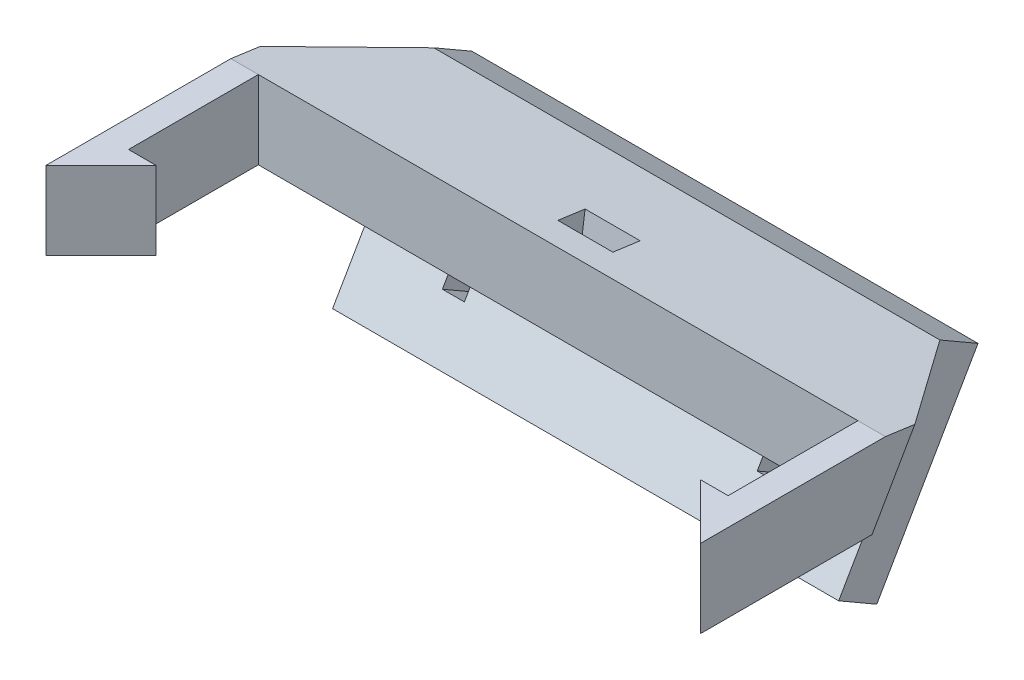
ISO-10303-21;
HEADER;
FILE_DESCRIPTION(('STEP AP214'),'2;1');
FILE_NAME('part.step','',(''),(''),'','','');
FILE_SCHEMA(('AUTOMOTIVE_DESIGN { 1 0 10303 214 1 1 1 1 }'));
ENDSEC;
DATA;
#1=APPLICATION_CONTEXT('core data for automotive mechanical design processes');
#2=APPLICATION_PROTOCOL_DEFINITION('international standard','automotive_design',2000,#1);
#3=PRODUCT_CONTEXT('',#1,'mechanical');
#4=PRODUCT('Part','Part','',(#3));
#5=PRODUCT_RELATED_PRODUCT_CATEGORY('part','',(#4));
#6=PRODUCT_DEFINITION_FORMATION('','',#4);
#7=PRODUCT_DEFINITION_CONTEXT('part definition',#1,'design');
#8=PRODUCT_DEFINITION('design','',#6,#7);
#9=PRODUCT_DEFINITION_SHAPE('','',#8);
#10=(LENGTH_UNIT() NAMED_UNIT(*) SI_UNIT(.MILLI.,.METRE.));
#11=(NAMED_UNIT(*) PLANE_ANGLE_UNIT() SI_UNIT($,.RADIAN.));
#12=(NAMED_UNIT(*) SI_UNIT($,.STERADIAN.) SOLID_ANGLE_UNIT());
#13=UNCERTAINTY_MEASURE_WITH_UNIT(LENGTH_MEASURE(1.E-05),#10,'distance_accuracy_value','');
#14=(GEOMETRIC_REPRESENTATION_CONTEXT(3) GLOBAL_UNCERTAINTY_ASSIGNED_CONTEXT((#13)) GLOBAL_UNIT_ASSIGNED_CONTEXT((#10,
#11,#12)) REPRESENTATION_CONTEXT('',''));
#15=CARTESIAN_POINT('',(0.,0.,0.));
#16=DIRECTION('',(0.,0.,1.));
#17=DIRECTION('',(1.,0.,0.));
#18=AXIS2_PLACEMENT_3D('',#15,#16,#17);
#19=CARTESIAN_POINT('',(37.7825,2.45728163563475,-14.859));
#20=DIRECTION('',(0.,-0.990554370221696,0.137120529588754));
#21=DIRECTION('',(0.,-0.137120529588754,-0.990554370221696));
#22=AXIS2_PLACEMENT_3D('',#19,#20,#21);
#23=PLANE('',#22);
#24=DIRECTION('',(0.,0.137120529588754,0.990554370221695));
#25=VECTOR('',#24,1.);
#26=CARTESIAN_POINT('',(37.7825,2.45728163563475,-14.859));
#27=LINE('',#26,#25);
#28=CARTESIAN_POINT('',(37.7825,4.04424143907504,-3.39485255702757));
#29=VERTEX_POINT('',#28);
#30=CARTESIAN_POINT('',(37.7825,4.51418432609816,0.));
#31=VERTEX_POINT('',#30);
#32=EDGE_CURVE('E369',#29,#31,#27,.T.);
#33=ORIENTED_EDGE('',*,*,#32,.F.);
#34=DIRECTION('',(-0.595207919734796,-0.110186181779928,-0.795981493270879));
#35=VECTOR('',#34,1.);
#36=CARTESIAN_POINT('',(32.247000729487,3.01949780136409,-10.7975681951293));
#37=LINE('',#36,#35);
#38=CARTESIAN_POINT('',(29.21,2.45728163563475,-14.859));
#39=VERTEX_POINT('',#38);
#40=EDGE_CURVE('E309',#29,#39,#37,.T.);
#41=ORIENTED_EDGE('',*,*,#40,.T.);
#42=DIRECTION('',(1.,0.,0.));
#43=VECTOR('',#42,1.);
#44=CARTESIAN_POINT('',(37.7825,2.45728163563475,-14.859));
#45=LINE('',#44,#43);
#46=CARTESIAN_POINT('',(-29.21,2.45728163563475,-14.859));
#47=VERTEX_POINT('',#46);
#48=EDGE_CURVE('E375',#47,#39,#45,.T.);
#49=ORIENTED_EDGE('',*,*,#48,.F.);
#50=DIRECTION('',(-0.595207919734796,0.110186181779928,0.795981493270879));
#51=VECTOR('',#50,1.);
#52=CARTESIAN_POINT('',(-5.47640170660133,-1.93633358543527,-46.5983374380638));
#53=LINE('',#52,#51);
#54=CARTESIAN_POINT('',(-37.7825,4.04424143907504,-3.39485255702757));
#55=VERTEX_POINT('',#54);
#56=EDGE_CURVE('E328',#47,#55,#53,.T.);
#57=ORIENTED_EDGE('',*,*,#56,.T.);
#58=DIRECTION('',(0.,0.137120529588754,0.990554370221695));
#59=VECTOR('',#58,1.);
#60=CARTESIAN_POINT('',(-37.7825,2.45728163563475,-14.859));
#61=LINE('',#60,#59);
#62=CARTESIAN_POINT('',(-37.7825,4.51418432609816,0.));
#63=VERTEX_POINT('',#62);
#64=EDGE_CURVE('E366',#55,#63,#61,.T.);
#65=ORIENTED_EDGE('',*,*,#64,.T.);
#66=DIRECTION('',(-1.,0.,0.));
#67=VECTOR('',#66,1.);
#68=CARTESIAN_POINT('',(-37.7825,4.51418432609816,0.));
#69=LINE('',#68,#67);
#70=CARTESIAN_POINT('',(-34.6075,4.51418432609816,0.));
#71=VERTEX_POINT('',#70);
#72=EDGE_CURVE('E444',#71,#63,#69,.T.);
#73=ORIENTED_EDGE('',*,*,#72,.F.);
#74=DIRECTION('',(-1.,0.,0.));
#75=VECTOR('',#74,1.);
#76=CARTESIAN_POINT('',(37.7825,4.51418432609816,0.));
#77=LINE('',#76,#75);
#78=CARTESIAN_POINT('',(34.6075,4.51418432609816,0.));
#79=VERTEX_POINT('',#78);
#80=EDGE_CURVE('E371',#79,#71,#77,.T.);
#81=ORIENTED_EDGE('',*,*,#80,.F.);
#82=DIRECTION('',(-1.,0.,0.));
#83=VECTOR('',#82,1.);
#84=CARTESIAN_POINT('',(37.7825,4.51418432609816,0.));
#85=LINE('',#84,#83);
#86=EDGE_CURVE('E415',#31,#79,#85,.T.);
#87=ORIENTED_EDGE('',*,*,#86,.F.);
#88=EDGE_LOOP('',(#33,#41,#49,#57,#65,#73,#81,#87));
#89=FACE_BOUND('',#88,.T.);
#90=DIRECTION('',(0.,0.137120529588754,0.990554370221696));
#91=VECTOR('',#90,1.);
#92=CARTESIAN_POINT('',(-3.175,2.45728163563475,-14.859));
#93=LINE('',#92,#91);
#94=CARTESIAN_POINT('',(-3.175,3.64346896320957,-6.29002025090777));
#95=VERTEX_POINT('',#94);
#96=CARTESIAN_POINT('',(-3.175,4.07882664465387,-3.14501012545389));
#97=VERTEX_POINT('',#96);
#98=EDGE_CURVE('E361',#95,#97,#93,.T.);
#99=ORIENTED_EDGE('',*,*,#98,.F.);
#100=DIRECTION('',(-1.,0.,0.));
#101=VECTOR('',#100,1.);
#102=CARTESIAN_POINT('',(37.7825,3.64346896320957,-6.29002025090777));
#103=LINE('',#102,#101);
#104=CARTESIAN_POINT('',(3.175,3.64346896320957,-6.29002025090777));
#105=VERTEX_POINT('',#104);
#106=EDGE_CURVE('E354',#105,#95,#103,.T.);
#107=ORIENTED_EDGE('',*,*,#106,.F.);
#108=DIRECTION('',(0.,-0.137120529588754,-0.990554370221696));
#109=VECTOR('',#108,1.);
#110=CARTESIAN_POINT('',(3.175,2.45728163563475,-14.859));
#111=LINE('',#110,#109);
#112=CARTESIAN_POINT('',(3.175,4.07882664465387,-3.14501012545389));
#113=VERTEX_POINT('',#112);
#114=EDGE_CURVE('E356',#113,#105,#111,.T.);
#115=ORIENTED_EDGE('',*,*,#114,.F.);
#116=DIRECTION('',(1.,0.,0.));
#117=VECTOR('',#116,1.);
#118=CARTESIAN_POINT('',(37.7825,4.07882664465387,-3.14501012545389));
#119=LINE('',#118,#117);
#120=EDGE_CURVE('E359',#97,#113,#119,.T.);
#121=ORIENTED_EDGE('',*,*,#120,.F.);
#122=EDGE_LOOP('',(#99,#107,#115,#121));
#123=FACE_BOUND('',#122,.T.);
#124=ADVANCED_FACE('F32',(#89,#123),#23,.F.);
#125=CARTESIAN_POINT('',(37.7825,-9.20545357308142,-8.12551668776039));
#126=DIRECTION('',(0.,0.866025403784439,-0.5));
#127=DIRECTION('',(0.,0.5,0.866025403784439));
#128=AXIS2_PLACEMENT_3D('',#125,#126,#127);
#129=PLANE('',#128);
#130=DIRECTION('',(-1.,0.,0.));
#131=VECTOR('',#130,1.);
#132=CARTESIAN_POINT('',(37.7825,-9.20545357308142,-8.12551668776039));
#133=LINE('',#132,#131);
#134=CARTESIAN_POINT('',(29.21,-9.20545357308142,-8.12551668776039));
#135=VERTEX_POINT('',#134);
#136=CARTESIAN_POINT('',(-29.21,-9.20545357308143,-8.1255166877604));
#137=VERTEX_POINT('',#136);
#138=EDGE_CURVE('E364',#135,#137,#133,.T.);
#139=ORIENTED_EDGE('',*,*,#138,.F.);
#140=DIRECTION('',(0.62447833761495,0.39052106404446,0.676402324350864));
#141=VECTOR('',#140,1.);
#142=CARTESIAN_POINT('',(32.5530452068537,-7.11486132561386,-4.50450469723697));
#143=LINE('',#142,#141);
#144=CARTESIAN_POINT('',(36.7117618520232,-4.51418432609816,0.));
#145=VERTEX_POINT('',#144);
#146=EDGE_CURVE('E306',#135,#145,#143,.T.);
#147=ORIENTED_EDGE('',*,*,#146,.T.);
#148=DIRECTION('',(1.,0.,0.));
#149=VECTOR('',#148,1.);
#150=CARTESIAN_POINT('',(37.7825,-4.51418432609816,0.));
#151=LINE('',#150,#149);
#152=CARTESIAN_POINT('',(34.6075,-4.51418432609816,0.));
#153=VERTEX_POINT('',#152);
#154=EDGE_CURVE('E420',#153,#145,#151,.T.);
#155=ORIENTED_EDGE('',*,*,#154,.F.);
#156=DIRECTION('',(-1.,0.,0.));
#157=VECTOR('',#156,1.);
#158=CARTESIAN_POINT('',(37.7825,-4.51418432609816,0.));
#159=LINE('',#158,#157);
#160=CARTESIAN_POINT('',(-34.6075,-4.51418432609816,0.));
#161=VERTEX_POINT('',#160);
#162=EDGE_CURVE('E363',#153,#161,#159,.T.);
#163=ORIENTED_EDGE('',*,*,#162,.T.);
#164=DIRECTION('',(1.,0.,0.));
#165=VECTOR('',#164,1.);
#166=CARTESIAN_POINT('',(-37.7825,-4.51418432609816,0.));
#167=LINE('',#166,#165);
#168=CARTESIAN_POINT('',(-36.7117618520232,-4.51418432609816,0.));
#169=VERTEX_POINT('',#168);
#170=EDGE_CURVE('E439',#169,#161,#167,.T.);
#171=ORIENTED_EDGE('',*,*,#170,.F.);
#172=DIRECTION('',(0.62447833761495,-0.39052106404446,-0.676402324350864));
#173=VECTOR('',#172,1.);
#174=CARTESIAN_POINT('',(-3.08472079088397,-25.5430448403279,-36.4230548359249));
#175=LINE('',#174,#173);
#176=EDGE_CURVE('E325',#169,#137,#175,.T.);
#177=ORIENTED_EDGE('',*,*,#176,.T.);
#178=EDGE_LOOP('',(#139,#147,#155,#163,#171,#177));
#179=FACE_BOUND('',#178,.T.);
#180=DIRECTION('',(0.,-0.5,-0.866025403784439));
#181=VECTOR('',#180,1.);
#182=CARTESIAN_POINT('',(-3.175,-10.3806394339781,-10.1609983071701));
#183=LINE('',#182,#181);
#184=CARTESIAN_POINT('',(-3.175,-5.55963649656401,-1.81077627613001));
#185=VERTEX_POINT('',#184);
#186=CARTESIAN_POINT('',(-3.175,-7.27324892364753,-4.77884006432008));
#187=VERTEX_POINT('',#186);
#188=EDGE_CURVE('E340',#185,#187,#183,.T.);
#189=ORIENTED_EDGE('',*,*,#188,.F.);
#190=DIRECTION('',(-1.,0.,0.));
#191=VECTOR('',#190,1.);
#192=CARTESIAN_POINT('',(-3.175,-5.55963649656401,-1.81077627613001));
#193=LINE('',#192,#191);
#194=CARTESIAN_POINT('',(3.175,-5.55963649656401,-1.81077627613001));
#195=VERTEX_POINT('',#194);
#196=EDGE_CURVE('E342',#195,#185,#193,.T.);
#197=ORIENTED_EDGE('',*,*,#196,.F.);
#198=DIRECTION('',(0.,0.5,0.866025403784439));
#199=VECTOR('',#198,1.);
#200=CARTESIAN_POINT('',(3.175,-10.3806394339781,-10.1609983071701));
#201=LINE('',#200,#199);
#202=CARTESIAN_POINT('',(3.175,-7.27324892364753,-4.77884006432008));
#203=VERTEX_POINT('',#202);
#204=EDGE_CURVE('E334',#203,#195,#201,.T.);
#205=ORIENTED_EDGE('',*,*,#204,.F.);
#206=DIRECTION('',(1.,0.,0.));
#207=VECTOR('',#206,1.);
#208=CARTESIAN_POINT('',(-3.175,-7.27324892364753,-4.77884006432008));
#209=LINE('',#208,#207);
#210=EDGE_CURVE('E337',#187,#203,#209,.T.);
#211=ORIENTED_EDGE('',*,*,#210,.F.);
#212=EDGE_LOOP('',(#189,#197,#205,#211));
#213=FACE_BOUND('',#212,.T.);
#214=ADVANCED_FACE('F501',(#179,#213),#129,.F.);
#215=CARTESIAN_POINT('',(0.,0.,0.));
#216=DIRECTION('',(0.,0.,1.));
#217=DIRECTION('',(1.,0.,0.));
#218=AXIS2_PLACEMENT_3D('',#215,#216,#217);
#219=PLANE('',#218);
#220=ORIENTED_EDGE('',*,*,#162,.F.);
#221=DIRECTION('',(0.,-1.,0.));
#222=VECTOR('',#221,1.);
#223=CARTESIAN_POINT('',(34.6075,4.51418432609816,0.));
#224=LINE('',#223,#222);
#225=EDGE_CURVE('E423',#79,#153,#224,.T.);
#226=ORIENTED_EDGE('',*,*,#225,.F.);
#227=ORIENTED_EDGE('',*,*,#80,.T.);
#228=DIRECTION('',(0.,1.,0.));
#229=VECTOR('',#228,1.);
#230=CARTESIAN_POINT('',(-34.6075,4.51418432609816,0.));
#231=LINE('',#230,#229);
#232=EDGE_CURVE('E446',#161,#71,#231,.T.);
#233=ORIENTED_EDGE('',*,*,#232,.F.);
#234=EDGE_LOOP('',(#220,#226,#227,#233));
#235=FACE_BOUND('',#234,.T.);
#236=ADVANCED_FACE('F540',(#235),#219,.T.);
#237=CARTESIAN_POINT('',(-37.7825,17.78,-3.175));
#238=DIRECTION('',(-1.,0.,0.));
#239=DIRECTION('',(0.,0.,1.));
#240=AXIS2_PLACEMENT_3D('',#237,#238,#239);
#241=PLANE('',#240);
#242=DIRECTION('',(0.,0.866025403784438,-0.500000000000001));
#243=VECTOR('',#242,1.);
#244=CARTESIAN_POINT('',(-37.7825,-24.9377129260479,13.3378865973176));
#245=LINE('',#244,#243);
#246=CARTESIAN_POINT('',(-37.7825,-4.51418432609816,1.54635686233462));
#247=VERTEX_POINT('',#246);
#248=EDGE_CURVE('E314',#247,#55,#245,.T.);
#249=ORIENTED_EDGE('',*,*,#248,.F.);
#250=DIRECTION('',(0.,0.,-1.));
#251=VECTOR('',#250,1.);
#252=CARTESIAN_POINT('',(-37.7825,-4.51418432609816,14.986));
#253=LINE('',#252,#251);
#254=CARTESIAN_POINT('',(-37.7825,-4.51418432609816,21.336));
#255=VERTEX_POINT('',#254);
#256=EDGE_CURVE('E459',#255,#247,#253,.T.);
#257=ORIENTED_EDGE('',*,*,#256,.F.);
#258=DIRECTION('',(0.,-1.,0.));
#259=VECTOR('',#258,1.);
#260=CARTESIAN_POINT('',(-37.7825,13.4944404471673,21.336));
#261=LINE('',#260,#259);
#262=CARTESIAN_POINT('',(-37.7825,4.51418432609816,21.336));
#263=VERTEX_POINT('',#262);
#264=EDGE_CURVE('E403',#263,#255,#261,.T.);
#265=ORIENTED_EDGE('',*,*,#264,.F.);
#266=DIRECTION('',(0.,0.,-1.));
#267=VECTOR('',#266,1.);
#268=CARTESIAN_POINT('',(-37.7825,4.51418432609816,14.986));
#269=LINE('',#268,#267);
#270=EDGE_CURVE('E443',#263,#63,#269,.T.);
#271=ORIENTED_EDGE('',*,*,#270,.T.);
#272=ORIENTED_EDGE('',*,*,#64,.F.);
#273=EDGE_LOOP('',(#249,#257,#265,#271,#272));
#274=FACE_BOUND('',#273,.T.);
#275=ADVANCED_FACE('F34',(#274),#241,.T.);
#276=CARTESIAN_POINT('',(37.7825,17.78,-3.175));
#277=DIRECTION('',(1.,0.,0.));
#278=DIRECTION('',(0.,0.,-1.));
#279=AXIS2_PLACEMENT_3D('',#276,#277,#278);
#280=PLANE('',#279);
#281=DIRECTION('',(0.,0.866025403784438,-0.500000000000001));
#282=VECTOR('',#281,1.);
#283=CARTESIAN_POINT('',(37.7825,-24.9377129260479,13.3378865973176));
#284=LINE('',#283,#282);
#285=CARTESIAN_POINT('',(37.7825,-4.51418432609816,1.54635686233462));
#286=VERTEX_POINT('',#285);
#287=EDGE_CURVE('E293',#286,#29,#284,.T.);
#288=ORIENTED_EDGE('',*,*,#287,.T.);
#289=ORIENTED_EDGE('',*,*,#32,.T.);
#290=DIRECTION('',(0.,0.,-1.));
#291=VECTOR('',#290,1.);
#292=CARTESIAN_POINT('',(37.7825,4.51418432609816,14.986));
#293=LINE('',#292,#291);
#294=CARTESIAN_POINT('',(37.7825,4.51418432609816,21.336));
#295=VERTEX_POINT('',#294);
#296=EDGE_CURVE('E436',#295,#31,#293,.T.);
#297=ORIENTED_EDGE('',*,*,#296,.F.);
#298=DIRECTION('',(0.,-1.,0.));
#299=VECTOR('',#298,1.);
#300=CARTESIAN_POINT('',(37.7825,13.4944404471673,21.336));
#301=LINE('',#300,#299);
#302=CARTESIAN_POINT('',(37.7825,-4.51418432609816,21.336));
#303=VERTEX_POINT('',#302);
#304=EDGE_CURVE('E393',#295,#303,#301,.T.);
#305=ORIENTED_EDGE('',*,*,#304,.T.);
#306=DIRECTION('',(0.,0.,-1.));
#307=VECTOR('',#306,1.);
#308=CARTESIAN_POINT('',(37.7825,-4.51418432609816,14.986));
#309=LINE('',#308,#307);
#310=EDGE_CURVE('E419',#303,#286,#309,.T.);
#311=ORIENTED_EDGE('',*,*,#310,.T.);
#312=EDGE_LOOP('',(#288,#289,#297,#305,#311));
#313=FACE_BOUND('',#312,.T.);
#314=ADVANCED_FACE('F494',(#313),#280,.T.);
#315=CARTESIAN_POINT('',(-37.7825,-4.51418432609816,14.986));
#316=DIRECTION('',(0.,1.,0.));
#317=DIRECTION('',(0.,0.,1.));
#318=AXIS2_PLACEMENT_3D('',#315,#316,#317);
#319=PLANE('',#318);
#320=ORIENTED_EDGE('',*,*,#256,.T.);
#321=DIRECTION('',(0.56927589116486,0.,-0.822146556119074));
#322=VECTOR('',#321,1.);
#323=CARTESIAN_POINT('',(-44.0726321664928,-4.51418432609816,10.6305471090603));
#324=LINE('',#323,#322);
#325=EDGE_CURVE('E318',#247,#169,#324,.T.);
#326=ORIENTED_EDGE('',*,*,#325,.T.);
#327=ORIENTED_EDGE('',*,*,#170,.T.);
#328=DIRECTION('',(0.,0.,-1.));
#329=VECTOR('',#328,1.);
#330=CARTESIAN_POINT('',(-34.6075,-4.51418432609816,14.986));
#331=LINE('',#330,#329);
#332=CARTESIAN_POINT('',(-34.6075,-4.51418432609816,14.986));
#333=VERTEX_POINT('',#332);
#334=EDGE_CURVE('E456',#333,#161,#331,.T.);
#335=ORIENTED_EDGE('',*,*,#334,.F.);
#336=DIRECTION('',(1.,0.,0.));
#337=VECTOR('',#336,1.);
#338=CARTESIAN_POINT('',(-37.7825,-4.51418432609816,14.986));
#339=LINE('',#338,#337);
#340=CARTESIAN_POINT('',(-31.4325,-4.51418432609816,14.986));
#341=VERTEX_POINT('',#340);
#342=EDGE_CURVE('E399',#333,#341,#339,.T.);
#343=ORIENTED_EDGE('',*,*,#342,.T.);
#344=DIRECTION('',(-0.707106781186547,0.,0.707106781186547));
#345=VECTOR('',#344,1.);
#346=CARTESIAN_POINT('',(-31.4325,-4.51418432609816,14.986));
#347=LINE('',#346,#345);
#348=EDGE_CURVE('E405',#341,#255,#347,.T.);
#349=ORIENTED_EDGE('',*,*,#348,.T.);
#350=EDGE_LOOP('',(#320,#326,#327,#335,#343,#349));
#351=FACE_BOUND('',#350,.T.);
#352=ADVANCED_FACE('F509',(#351),#319,.F.);
#353=CARTESIAN_POINT('',(-34.6075,4.51418432609816,14.986));
#354=DIRECTION('',(-1.,0.,0.));
#355=DIRECTION('',(0.,0.,1.));
#356=AXIS2_PLACEMENT_3D('',#353,#354,#355);
#357=PLANE('',#356);
#358=ORIENTED_EDGE('',*,*,#232,.T.);
#359=DIRECTION('',(0.,0.,-1.));
#360=VECTOR('',#359,1.);
#361=CARTESIAN_POINT('',(-34.6075,4.51418432609816,14.986));
#362=LINE('',#361,#360);
#363=CARTESIAN_POINT('',(-34.6075,4.51418432609816,14.986));
#364=VERTEX_POINT('',#363);
#365=EDGE_CURVE('E453',#364,#71,#362,.T.);
#366=ORIENTED_EDGE('',*,*,#365,.F.);
#367=DIRECTION('',(0.,1.,0.));
#368=VECTOR('',#367,1.);
#369=CARTESIAN_POINT('',(-34.6075,4.51418432609816,14.986));
#370=LINE('',#369,#368);
#371=EDGE_CURVE('E440',#333,#364,#370,.T.);
#372=ORIENTED_EDGE('',*,*,#371,.F.);
#373=ORIENTED_EDGE('',*,*,#334,.T.);
#374=EDGE_LOOP('',(#358,#366,#372,#373));
#375=FACE_BOUND('',#374,.T.);
#376=ADVANCED_FACE('F577',(#375),#357,.F.);
#377=CARTESIAN_POINT('',(-37.7825,4.51418432609816,14.986));
#378=DIRECTION('',(0.,-1.,0.));
#379=DIRECTION('',(0.,0.,-1.));
#380=AXIS2_PLACEMENT_3D('',#377,#378,#379);
#381=PLANE('',#380);
#382=ORIENTED_EDGE('',*,*,#72,.T.);
#383=ORIENTED_EDGE('',*,*,#270,.F.);
#384=DIRECTION('',(0.707106781186548,0.,-0.707106781186548));
#385=VECTOR('',#384,1.);
#386=CARTESIAN_POINT('',(-31.4325,4.51418432609816,14.986));
#387=LINE('',#386,#385);
#388=CARTESIAN_POINT('',(-31.4325,4.51418432609816,14.986));
#389=VERTEX_POINT('',#388);
#390=EDGE_CURVE('E400',#263,#389,#387,.T.);
#391=ORIENTED_EDGE('',*,*,#390,.T.);
#392=DIRECTION('',(-1.,0.,0.));
#393=VECTOR('',#392,1.);
#394=CARTESIAN_POINT('',(-37.7825,4.51418432609816,14.986));
#395=LINE('',#394,#393);
#396=EDGE_CURVE('E402',#389,#364,#395,.T.);
#397=ORIENTED_EDGE('',*,*,#396,.T.);
#398=ORIENTED_EDGE('',*,*,#365,.T.);
#399=EDGE_LOOP('',(#382,#383,#391,#397,#398));
#400=FACE_BOUND('',#399,.T.);
#401=ADVANCED_FACE('F520',(#400),#381,.F.);
#402=CARTESIAN_POINT('',(37.7825,4.51418432609816,14.986));
#403=DIRECTION('',(0.,-1.,0.));
#404=DIRECTION('',(1.,0.,0.));
#405=AXIS2_PLACEMENT_3D('',#402,#403,#404);
#406=PLANE('',#405);
#407=ORIENTED_EDGE('',*,*,#86,.T.);
#408=DIRECTION('',(0.,0.,-1.));
#409=VECTOR('',#408,1.);
#410=CARTESIAN_POINT('',(34.6075,4.51418432609816,14.986));
#411=LINE('',#410,#409);
#412=CARTESIAN_POINT('',(34.6075,4.51418432609816,14.986));
#413=VERTEX_POINT('',#412);
#414=EDGE_CURVE('E433',#413,#79,#411,.T.);
#415=ORIENTED_EDGE('',*,*,#414,.F.);
#416=DIRECTION('',(-1.,0.,0.));
#417=VECTOR('',#416,1.);
#418=CARTESIAN_POINT('',(37.7825,4.51418432609816,14.986));
#419=LINE('',#418,#417);
#420=CARTESIAN_POINT('',(31.4325,4.51418432609816,14.986));
#421=VERTEX_POINT('',#420);
#422=EDGE_CURVE('E384',#413,#421,#419,.T.);
#423=ORIENTED_EDGE('',*,*,#422,.T.);
#424=DIRECTION('',(0.707106781186548,0.,0.707106781186548));
#425=VECTOR('',#424,1.);
#426=CARTESIAN_POINT('',(31.4325,4.51418432609816,14.986));
#427=LINE('',#426,#425);
#428=EDGE_CURVE('E386',#421,#295,#427,.T.);
#429=ORIENTED_EDGE('',*,*,#428,.T.);
#430=ORIENTED_EDGE('',*,*,#296,.T.);
#431=EDGE_LOOP('',(#407,#415,#423,#429,#430));
#432=FACE_BOUND('',#431,.T.);
#433=ADVANCED_FACE('F570',(#432),#406,.F.);
#434=CARTESIAN_POINT('',(34.6075,4.51418432609816,14.986));
#435=DIRECTION('',(1.,0.,0.));
#436=DIRECTION('',(0.,0.,-1.));
#437=AXIS2_PLACEMENT_3D('',#434,#435,#436);
#438=PLANE('',#437);
#439=ORIENTED_EDGE('',*,*,#225,.T.);
#440=DIRECTION('',(0.,0.,-1.));
#441=VECTOR('',#440,1.);
#442=CARTESIAN_POINT('',(34.6075,-4.51418432609816,14.986));
#443=LINE('',#442,#441);
#444=CARTESIAN_POINT('',(34.6075,-4.51418432609816,14.986));
#445=VERTEX_POINT('',#444);
#446=EDGE_CURVE('E430',#445,#153,#443,.T.);
#447=ORIENTED_EDGE('',*,*,#446,.F.);
#448=DIRECTION('',(0.,-1.,0.));
#449=VECTOR('',#448,1.);
#450=CARTESIAN_POINT('',(34.6075,4.51418432609816,14.986));
#451=LINE('',#450,#449);
#452=EDGE_CURVE('E416',#413,#445,#451,.T.);
#453=ORIENTED_EDGE('',*,*,#452,.F.);
#454=ORIENTED_EDGE('',*,*,#414,.T.);
#455=EDGE_LOOP('',(#439,#447,#453,#454));
#456=FACE_BOUND('',#455,.T.);
#457=ADVANCED_FACE('F567',(#456),#438,.F.);
#458=CARTESIAN_POINT('',(37.7825,-4.51418432609816,14.986));
#459=DIRECTION('',(0.,1.,0.));
#460=DIRECTION('',(-1.,0.,0.));
#461=AXIS2_PLACEMENT_3D('',#458,#459,#460);
#462=PLANE('',#461);
#463=ORIENTED_EDGE('',*,*,#154,.T.);
#464=DIRECTION('',(0.56927589116486,0.,0.822146556119074));
#465=VECTOR('',#464,1.);
#466=CARTESIAN_POINT('',(44.0726321664928,-4.51418432609816,10.6305471090603));
#467=LINE('',#466,#465);
#468=EDGE_CURVE('E303',#145,#286,#467,.T.);
#469=ORIENTED_EDGE('',*,*,#468,.T.);
#470=ORIENTED_EDGE('',*,*,#310,.F.);
#471=DIRECTION('',(-0.707106781186547,0.,-0.707106781186548));
#472=VECTOR('',#471,1.);
#473=CARTESIAN_POINT('',(31.4325,-4.51418432609816,14.986));
#474=LINE('',#473,#472);
#475=CARTESIAN_POINT('',(31.4325,-4.51418432609816,14.986));
#476=VERTEX_POINT('',#475);
#477=EDGE_CURVE('E381',#303,#476,#474,.T.);
#478=ORIENTED_EDGE('',*,*,#477,.T.);
#479=DIRECTION('',(1.,0.,0.));
#480=VECTOR('',#479,1.);
#481=CARTESIAN_POINT('',(37.7825,-4.51418432609816,14.986));
#482=LINE('',#481,#480);
#483=EDGE_CURVE('E390',#476,#445,#482,.T.);
#484=ORIENTED_EDGE('',*,*,#483,.T.);
#485=ORIENTED_EDGE('',*,*,#446,.T.);
#486=EDGE_LOOP('',(#463,#469,#470,#478,#484,#485));
#487=FACE_BOUND('',#486,.T.);
#488=ADVANCED_FACE('F498',(#487),#462,.F.);
#489=CARTESIAN_POINT('',(-31.4325,13.4944404471673,14.986));
#490=DIRECTION('',(0.707106781186548,0.,0.707106781186548));
#491=DIRECTION('',(0.707106781186548,0.,-0.707106781186548));
#492=AXIS2_PLACEMENT_3D('',#489,#490,#491);
#493=PLANE('',#492);
#494=ORIENTED_EDGE('',*,*,#390,.F.);
#495=ORIENTED_EDGE('',*,*,#264,.T.);
#496=ORIENTED_EDGE('',*,*,#348,.F.);
#497=DIRECTION('',(0.,-1.,0.));
#498=VECTOR('',#497,1.);
#499=CARTESIAN_POINT('',(-31.4325,13.4944404471673,14.986));
#500=LINE('',#499,#498);
#501=EDGE_CURVE('E408',#389,#341,#500,.T.);
#502=ORIENTED_EDGE('',*,*,#501,.F.);
#503=EDGE_LOOP('',(#494,#495,#496,#502));
#504=FACE_BOUND('',#503,.T.);
#505=ADVANCED_FACE('F516',(#504),#493,.T.);
#506=CARTESIAN_POINT('',(-37.7825,13.4944404471673,14.986));
#507=DIRECTION('',(0.,0.,-1.));
#508=DIRECTION('',(-1.,0.,0.));
#509=AXIS2_PLACEMENT_3D('',#506,#507,#508);
#510=PLANE('',#509);
#511=ORIENTED_EDGE('',*,*,#342,.F.);
#512=ORIENTED_EDGE('',*,*,#371,.T.);
#513=ORIENTED_EDGE('',*,*,#396,.F.);
#514=ORIENTED_EDGE('',*,*,#501,.T.);
#515=EDGE_LOOP('',(#511,#512,#513,#514));
#516=FACE_BOUND('',#515,.T.);
#517=ADVANCED_FACE('F555',(#516),#510,.T.);
#518=CARTESIAN_POINT('',(37.7825,13.4944404471673,14.986));
#519=DIRECTION('',(0.,0.,-1.));
#520=DIRECTION('',(-1.,0.,0.));
#521=AXIS2_PLACEMENT_3D('',#518,#519,#520);
#522=PLANE('',#521);
#523=ORIENTED_EDGE('',*,*,#422,.F.);
#524=ORIENTED_EDGE('',*,*,#452,.T.);
#525=ORIENTED_EDGE('',*,*,#483,.F.);
#526=DIRECTION('',(0.,-1.,0.));
#527=VECTOR('',#526,1.);
#528=CARTESIAN_POINT('',(31.4325,13.4944404471673,14.986));
#529=LINE('',#528,#527);
#530=EDGE_CURVE('E387',#421,#476,#529,.T.);
#531=ORIENTED_EDGE('',*,*,#530,.F.);
#532=EDGE_LOOP('',(#523,#524,#525,#531));
#533=FACE_BOUND('',#532,.T.);
#534=ADVANCED_FACE('F552',(#533),#522,.T.);
#535=CARTESIAN_POINT('',(31.4325,13.4944404471673,14.986));
#536=DIRECTION('',(-0.707106781186547,0.,0.707106781186547));
#537=DIRECTION('',(0.707106781186548,0.,0.707106781186548));
#538=AXIS2_PLACEMENT_3D('',#535,#536,#537);
#539=PLANE('',#538);
#540=ORIENTED_EDGE('',*,*,#428,.F.);
#541=ORIENTED_EDGE('',*,*,#530,.T.);
#542=ORIENTED_EDGE('',*,*,#477,.F.);
#543=ORIENTED_EDGE('',*,*,#304,.F.);
#544=EDGE_LOOP('',(#540,#541,#542,#543));
#545=FACE_BOUND('',#544,.T.);
#546=ADVANCED_FACE('F551',(#545),#539,.T.);
#547=CARTESIAN_POINT('',(37.7825,-20.32,-7.57440905122495));
#548=DIRECTION('',(0.,0.866025403784438,-0.500000000000001));
#549=DIRECTION('',(0.,0.500000000000001,0.866025403784438));
#550=AXIS2_PLACEMENT_3D('',#547,#548,#549);
#551=PLANE('',#550);
#552=DIRECTION('',(-1.,0.,0.));
#553=VECTOR('',#552,1.);
#554=CARTESIAN_POINT('',(37.7825,-20.32,-7.57440905122495));
#555=LINE('',#554,#553);
#556=CARTESIAN_POINT('',(29.21,-20.32,-7.57440905122495));
#557=VERTEX_POINT('',#556);
#558=CARTESIAN_POINT('',(-29.21,-20.32,-7.57440905122495));
#559=VERTEX_POINT('',#558);
#560=EDGE_CURVE('E376',#557,#559,#555,.T.);
#561=ORIENTED_EDGE('',*,*,#560,.F.);
#562=DIRECTION('',(0.,0.500000000000001,0.866025403784438));
#563=VECTOR('',#562,1.);
#564=CARTESIAN_POINT('',(29.21,-20.32,-7.57440905122495));
#565=LINE('',#564,#563);
#566=CARTESIAN_POINT('',(29.21,-17.78,-3.175));
#567=VERTEX_POINT('',#566);
#568=EDGE_CURVE('E296',#557,#567,#565,.T.);
#569=ORIENTED_EDGE('',*,*,#568,.T.);
#570=DIRECTION('',(1.,0.,0.));
#571=VECTOR('',#570,1.);
#572=CARTESIAN_POINT('',(-37.7825,-17.78,-3.175));
#573=LINE('',#572,#571);
#574=CARTESIAN_POINT('',(-29.21,-17.78,-3.175));
#575=VERTEX_POINT('',#574);
#576=EDGE_CURVE('E462',#575,#567,#573,.T.);
#577=ORIENTED_EDGE('',*,*,#576,.F.);
#578=DIRECTION('',(0.,-0.500000000000001,-0.866025403784438));
#579=VECTOR('',#578,1.);
#580=CARTESIAN_POINT('',(-29.21,-20.32,-7.57440905122495));
#581=LINE('',#580,#579);
#582=EDGE_CURVE('E331',#575,#559,#581,.T.);
#583=ORIENTED_EDGE('',*,*,#582,.T.);
#584=EDGE_LOOP('',(#561,#569,#577,#583));
#585=FACE_BOUND('',#584,.T.);
#586=ADVANCED_FACE('F473',(#585),#551,.F.);
#587=CARTESIAN_POINT('',(37.7825,-0.0827183643652596,-19.258409051225));
#588=DIRECTION('',(0.,-0.866025403784438,0.500000000000001));
#589=DIRECTION('',(0.,-0.500000000000001,-0.866025403784438));
#590=AXIS2_PLACEMENT_3D('',#587,#588,#589);
#591=PLANE('',#590);
#592=ORIENTED_EDGE('',*,*,#48,.T.);
#593=DIRECTION('',(0.,0.500000000000001,0.866025403784438));
#594=VECTOR('',#593,1.);
#595=CARTESIAN_POINT('',(29.21,-0.0827183643652609,-19.258409051225));
#596=LINE('',#595,#594);
#597=CARTESIAN_POINT('',(29.21,-0.0827183643652609,-19.258409051225));
#598=VERTEX_POINT('',#597);
#599=EDGE_CURVE('E290',#598,#39,#596,.T.);
#600=ORIENTED_EDGE('',*,*,#599,.F.);
#601=DIRECTION('',(1.,0.,0.));
#602=VECTOR('',#601,1.);
#603=CARTESIAN_POINT('',(37.7825,-0.0827183643652596,-19.258409051225));
#604=LINE('',#603,#602);
#605=CARTESIAN_POINT('',(-29.21,-0.0827183643652609,-19.258409051225));
#606=VERTEX_POINT('',#605);
#607=EDGE_CURVE('E378',#606,#598,#604,.T.);
#608=ORIENTED_EDGE('',*,*,#607,.F.);
#609=DIRECTION('',(0.,-0.500000000000001,-0.866025403784438));
#610=VECTOR('',#609,1.);
#611=CARTESIAN_POINT('',(-29.21,-0.0827183643652609,-19.258409051225));
#612=LINE('',#611,#610);
#613=EDGE_CURVE('E312',#47,#606,#612,.T.);
#614=ORIENTED_EDGE('',*,*,#613,.F.);
#615=EDGE_LOOP('',(#592,#600,#608,#614));
#616=FACE_BOUND('',#615,.T.);
#617=ADVANCED_FACE('F484',(#616),#591,.F.);
#618=CARTESIAN_POINT('',(0.,-8.35981532850783,-14.4796248908686));
#619=DIRECTION('',(0.,0.500000000000001,0.866025403784438));
#620=DIRECTION('',(0.,-0.866025403784438,0.500000000000001));
#621=AXIS2_PLACEMENT_3D('',#618,#619,#620);
#622=PLANE('',#621);
#623=DIRECTION('',(1.,0.,0.));
#624=VECTOR('',#623,1.);
#625=CARTESIAN_POINT('',(-19.5658559979028,-11.7715606572612,-12.5098528069064));
#626=LINE('',#625,#624);
#627=CARTESIAN_POINT('',(-19.5658559979028,-11.7715606572612,-12.5098528069064));
#628=VERTEX_POINT('',#627);
#629=CARTESIAN_POINT('',(-17.0258559979028,-11.7715606572612,-12.5098528069064));
#630=VERTEX_POINT('',#629);
#631=EDGE_CURVE('E245',#628,#630,#626,.T.);
#632=ORIENTED_EDGE('',*,*,#631,.F.);
#633=DIRECTION('',(0.,0.866025403784438,-0.500000000000001));
#634=VECTOR('',#633,1.);
#635=CARTESIAN_POINT('',(-19.5658559979028,-11.7715606572612,-12.5098528069064));
#636=LINE('',#635,#634);
#637=CARTESIAN_POINT('',(-19.5658559979028,-15.0711174456799,-10.6048528069064));
#638=VERTEX_POINT('',#637);
#639=EDGE_CURVE('E47',#638,#628,#636,.T.);
#640=ORIENTED_EDGE('',*,*,#639,.F.);
#641=DIRECTION('',(-1.,0.,0.));
#642=VECTOR('',#641,1.);
#643=CARTESIAN_POINT('',(-19.5658559979028,-15.0711174456799,-10.6048528069064));
#644=LINE('',#643,#642);
#645=CARTESIAN_POINT('',(-17.0258559979028,-15.0711174456799,-10.6048528069064));
#646=VERTEX_POINT('',#645);
#647=EDGE_CURVE('E231',#646,#638,#644,.T.);
#648=ORIENTED_EDGE('',*,*,#647,.F.);
#649=DIRECTION('',(0.,-0.866025403784438,0.500000000000001));
#650=VECTOR('',#649,1.);
#651=CARTESIAN_POINT('',(-17.0258559979028,-11.7715606572612,-12.5098528069064));
#652=LINE('',#651,#650);
#653=EDGE_CURVE('E251',#630,#646,#652,.T.);
#654=ORIENTED_EDGE('',*,*,#653,.F.);
#655=EDGE_LOOP('',(#632,#640,#648,#654));
#656=FACE_BOUND('',#655,.T.);
#657=DIRECTION('',(-1.,0.,0.));
#658=VECTOR('',#657,1.);
#659=CARTESIAN_POINT('',(19.3205422549951,-15.0711174456799,-10.6048528069064));
#660=LINE('',#659,#658);
#661=CARTESIAN_POINT('',(19.3205422549951,-15.0711174456799,-10.6048528069064));
#662=VERTEX_POINT('',#661);
#663=CARTESIAN_POINT('',(16.7805422549951,-15.0711174456799,-10.6048528069064));
#664=VERTEX_POINT('',#663);
#665=EDGE_CURVE('E269',#662,#664,#660,.T.);
#666=ORIENTED_EDGE('',*,*,#665,.F.);
#667=DIRECTION('',(0.,-0.866025403784438,0.500000000000001));
#668=VECTOR('',#667,1.);
#669=CARTESIAN_POINT('',(19.3205422549951,-11.7715606572612,-12.5098528069064));
#670=LINE('',#669,#668);
#671=CARTESIAN_POINT('',(19.3205422549951,-11.7715606572612,-12.5098528069064));
#672=VERTEX_POINT('',#671);
#673=EDGE_CURVE('E267',#672,#662,#670,.T.);
#674=ORIENTED_EDGE('',*,*,#673,.F.);
#675=DIRECTION('',(1.,0.,0.));
#676=VECTOR('',#675,1.);
#677=CARTESIAN_POINT('',(19.3205422549951,-11.7715606572612,-12.5098528069064));
#678=LINE('',#677,#676);
#679=CARTESIAN_POINT('',(16.7805422549951,-11.7715606572612,-12.5098528069064));
#680=VERTEX_POINT('',#679);
#681=EDGE_CURVE('E275',#680,#672,#678,.T.);
#682=ORIENTED_EDGE('',*,*,#681,.F.);
#683=DIRECTION('',(0.,0.866025403784438,-0.500000000000001));
#684=VECTOR('',#683,1.);
#685=CARTESIAN_POINT('',(16.7805422549951,-11.7715606572612,-12.5098528069064));
#686=LINE('',#685,#684);
#687=EDGE_CURVE('E272',#664,#680,#686,.T.);
#688=ORIENTED_EDGE('',*,*,#687,.F.);
#689=EDGE_LOOP('',(#666,#674,#682,#688));
#690=FACE_BOUND('',#689,.T.);
#691=ORIENTED_EDGE('',*,*,#607,.T.);
#692=DIRECTION('',(0.,0.866025403784438,-0.500000000000001));
#693=VECTOR('',#692,1.);
#694=CARTESIAN_POINT('',(29.21,-32.8385743360802,-0.346806788418676));
#695=LINE('',#694,#693);
#696=EDGE_CURVE('E297',#557,#598,#695,.T.);
#697=ORIENTED_EDGE('',*,*,#696,.F.);
#698=ORIENTED_EDGE('',*,*,#560,.T.);
#699=DIRECTION('',(0.,0.866025403784438,-0.500000000000001));
#700=VECTOR('',#699,1.);
#701=CARTESIAN_POINT('',(-29.21,-32.8385743360802,-0.346806788418676));
#702=LINE('',#701,#700);
#703=EDGE_CURVE('E315',#559,#606,#702,.T.);
#704=ORIENTED_EDGE('',*,*,#703,.T.);
#705=EDGE_LOOP('',(#691,#697,#698,#704));
#706=FACE_BOUND('',#705,.T.);
#707=ADVANCED_FACE('F479',(#656,#690,#706),#622,.F.);
#708=CARTESIAN_POINT('',(37.7825,-17.78,-3.175));
#709=DIRECTION('',(0.,-0.5,-0.866025403784439));
#710=DIRECTION('',(0.,0.866025403784439,-0.5));
#711=AXIS2_PLACEMENT_3D('',#708,#709,#710);
#712=PLANE('',#711);
#713=DIRECTION('',(1.,0.,0.));
#714=VECTOR('',#713,1.);
#715=CARTESIAN_POINT('',(-19.5658559979028,-12.5311174456799,-6.20544375568145));
#716=LINE('',#715,#714);
#717=CARTESIAN_POINT('',(-19.5658559979028,-12.5311174456799,-6.20544375568145));
#718=VERTEX_POINT('',#717);
#719=CARTESIAN_POINT('',(-17.0258559979028,-12.5311174456799,-6.20544375568146));
#720=VERTEX_POINT('',#719);
#721=EDGE_CURVE('E243',#718,#720,#716,.T.);
#722=ORIENTED_EDGE('',*,*,#721,.F.);
#723=DIRECTION('',(0.,-0.866025403784439,0.5));
#724=VECTOR('',#723,1.);
#725=CARTESIAN_POINT('',(-19.5658559979028,-9.23156065726114,-8.11044375568148));
#726=LINE('',#725,#724);
#727=CARTESIAN_POINT('',(-19.5658559979028,-9.23156065726118,-8.11044375568145));
#728=VERTEX_POINT('',#727);
#729=EDGE_CURVE('E225',#728,#718,#726,.T.);
#730=ORIENTED_EDGE('',*,*,#729,.F.);
#731=DIRECTION('',(-1.,0.,0.));
#732=VECTOR('',#731,1.);
#733=CARTESIAN_POINT('',(-19.5658559979028,-9.23156065726118,-8.11044375568145));
#734=LINE('',#733,#732);
#735=CARTESIAN_POINT('',(-17.0258559979028,-9.23156065726118,-8.11044375568145));
#736=VERTEX_POINT('',#735);
#737=EDGE_CURVE('E234',#736,#728,#734,.T.);
#738=ORIENTED_EDGE('',*,*,#737,.F.);
#739=DIRECTION('',(0.,0.866025403784439,-0.5));
#740=VECTOR('',#739,1.);
#741=CARTESIAN_POINT('',(-17.0258559979028,-9.23156065726114,-8.11044375568148));
#742=LINE('',#741,#740);
#743=EDGE_CURVE('E55',#720,#736,#742,.T.);
#744=ORIENTED_EDGE('',*,*,#743,.F.);
#745=EDGE_LOOP('',(#722,#730,#738,#744));
#746=FACE_BOUND('',#745,.T.);
#747=DIRECTION('',(-1.,0.,0.));
#748=VECTOR('',#747,1.);
#749=CARTESIAN_POINT('',(19.3205422549951,-9.23156065726118,-8.11044375568145));
#750=LINE('',#749,#748);
#751=CARTESIAN_POINT('',(19.3205422549951,-9.23156065726118,-8.11044375568145));
#752=VERTEX_POINT('',#751);
#753=CARTESIAN_POINT('',(16.7805422549951,-9.23156065726118,-8.11044375568145));
#754=VERTEX_POINT('',#753);
#755=EDGE_CURVE('E261',#752,#754,#750,.T.);
#756=ORIENTED_EDGE('',*,*,#755,.F.);
#757=DIRECTION('',(0.,0.866025403784439,-0.5));
#758=VECTOR('',#757,1.);
#759=CARTESIAN_POINT('',(19.3205422549951,-9.23156065726114,-8.11044375568148));
#760=LINE('',#759,#758);
#761=CARTESIAN_POINT('',(19.3205422549951,-12.5311174456799,-6.20544375568145));
#762=VERTEX_POINT('',#761);
#763=EDGE_CURVE('E264',#762,#752,#760,.T.);
#764=ORIENTED_EDGE('',*,*,#763,.F.);
#765=DIRECTION('',(1.,0.,0.));
#766=VECTOR('',#765,1.);
#767=CARTESIAN_POINT('',(19.3205422549951,-12.5311174456799,-6.20544375568145));
#768=LINE('',#767,#766);
#769=CARTESIAN_POINT('',(16.7805422549951,-12.5311174456799,-6.20544375568145));
#770=VERTEX_POINT('',#769);
#771=EDGE_CURVE('E281',#770,#762,#768,.T.);
#772=ORIENTED_EDGE('',*,*,#771,.F.);
#773=DIRECTION('',(0.,-0.866025403784439,0.5));
#774=VECTOR('',#773,1.);
#775=CARTESIAN_POINT('',(16.7805422549951,-9.23156065726114,-8.11044375568148));
#776=LINE('',#775,#774);
#777=EDGE_CURVE('E237',#754,#770,#776,.T.);
#778=ORIENTED_EDGE('',*,*,#777,.F.);
#779=EDGE_LOOP('',(#756,#764,#772,#778));
#780=FACE_BOUND('',#779,.T.);
#781=ORIENTED_EDGE('',*,*,#576,.T.);
#782=DIRECTION('',(0.,0.866025403784439,-0.5));
#783=VECTOR('',#782,1.);
#784=CARTESIAN_POINT('',(29.21,-17.78,-3.175));
#785=LINE('',#784,#783);
#786=EDGE_CURVE('E11',#567,#135,#785,.T.);
#787=ORIENTED_EDGE('',*,*,#786,.T.);
#788=ORIENTED_EDGE('',*,*,#138,.T.);
#789=DIRECTION('',(0.,-0.866025403784439,0.5));
#790=VECTOR('',#789,1.);
#791=CARTESIAN_POINT('',(-29.21,-17.7800000000001,-3.17499999999997));
#792=LINE('',#791,#790);
#793=EDGE_CURVE('E40',#137,#575,#792,.T.);
#794=ORIENTED_EDGE('',*,*,#793,.T.);
#795=EDGE_LOOP('',(#781,#787,#788,#794));
#796=FACE_BOUND('',#795,.T.);
#797=ADVANCED_FACE('F240',(#746,#780,#796),#712,.F.);
#798=CARTESIAN_POINT('',(-3.175,6.2592489172015,-6.65211762119018));
#799=DIRECTION('',(1.,0.,0.));
#800=DIRECTION('',(0.,0.,-1.));
#801=AXIS2_PLACEMENT_3D('',#798,#799,#800);
#802=PLANE('',#801);
#803=ORIENTED_EDGE('',*,*,#98,.T.);
#804=DIRECTION('',(0.,-0.990554370221695,0.137120529588754));
#805=VECTOR('',#804,1.);
#806=CARTESIAN_POINT('',(-3.175,6.69460659864579,-3.50710749573629));
#807=LINE('',#806,#805);
#808=EDGE_CURVE('E352',#97,#185,#807,.T.);
#809=ORIENTED_EDGE('',*,*,#808,.T.);
#810=ORIENTED_EDGE('',*,*,#188,.T.);
#811=DIRECTION('',(0.,-0.990554370221695,0.137120529588754));
#812=VECTOR('',#811,1.);
#813=CARTESIAN_POINT('',(-3.175,6.2592489172015,-6.65211762119018));
#814=LINE('',#813,#812);
#815=EDGE_CURVE('E345',#95,#187,#814,.T.);
#816=ORIENTED_EDGE('',*,*,#815,.F.);
#817=EDGE_LOOP('',(#803,#809,#810,#816));
#818=FACE_BOUND('',#817,.T.);
#819=ADVANCED_FACE('F647',(#818),#802,.T.);
#820=CARTESIAN_POINT('',(-3.175,6.69460659864579,-3.50710749573629));
#821=DIRECTION('',(0.,-0.137120529588754,-0.990554370221695));
#822=DIRECTION('',(0.,0.990554370221695,-0.137120529588754));
#823=AXIS2_PLACEMENT_3D('',#820,#821,#822);
#824=PLANE('',#823);
#825=ORIENTED_EDGE('',*,*,#120,.T.);
#826=DIRECTION('',(0.,-0.990554370221695,0.137120529588754));
#827=VECTOR('',#826,1.);
#828=CARTESIAN_POINT('',(3.175,6.69460659864579,-3.50710749573629));
#829=LINE('',#828,#827);
#830=EDGE_CURVE('E350',#113,#195,#829,.T.);
#831=ORIENTED_EDGE('',*,*,#830,.T.);
#832=ORIENTED_EDGE('',*,*,#196,.T.);
#833=ORIENTED_EDGE('',*,*,#808,.F.);
#834=EDGE_LOOP('',(#825,#831,#832,#833));
#835=FACE_BOUND('',#834,.T.);
#836=ADVANCED_FACE('F652',(#835),#824,.T.);
#837=CARTESIAN_POINT('',(3.175,6.2592489172015,-6.65211762119018));
#838=DIRECTION('',(-1.,0.,0.));
#839=DIRECTION('',(0.,0.,1.));
#840=AXIS2_PLACEMENT_3D('',#837,#838,#839);
#841=PLANE('',#840);
#842=ORIENTED_EDGE('',*,*,#114,.T.);
#843=DIRECTION('',(0.,-0.990554370221695,0.137120529588754));
#844=VECTOR('',#843,1.);
#845=CARTESIAN_POINT('',(3.175,6.2592489172015,-6.65211762119018));
#846=LINE('',#845,#844);
#847=EDGE_CURVE('E348',#105,#203,#846,.T.);
#848=ORIENTED_EDGE('',*,*,#847,.T.);
#849=ORIENTED_EDGE('',*,*,#204,.T.);
#850=ORIENTED_EDGE('',*,*,#830,.F.);
#851=EDGE_LOOP('',(#842,#848,#849,#850));
#852=FACE_BOUND('',#851,.T.);
#853=ADVANCED_FACE('F530',(#852),#841,.T.);
#854=CARTESIAN_POINT('',(-3.175,6.2592489172015,-6.65211762119018));
#855=DIRECTION('',(0.,0.137120529588754,0.990554370221695));
#856=DIRECTION('',(0.,-0.990554370221695,0.137120529588754));
#857=AXIS2_PLACEMENT_3D('',#854,#855,#856);
#858=PLANE('',#857);
#859=ORIENTED_EDGE('',*,*,#106,.T.);
#860=ORIENTED_EDGE('',*,*,#815,.T.);
#861=ORIENTED_EDGE('',*,*,#210,.T.);
#862=ORIENTED_EDGE('',*,*,#847,.F.);
#863=EDGE_LOOP('',(#859,#860,#861,#862));
#864=FACE_BOUND('',#863,.T.);
#865=ADVANCED_FACE('F523',(#864),#858,.T.);
#866=CARTESIAN_POINT('',(-29.21,-32.8385743360802,-0.346806788418676));
#867=DIRECTION('',(1.,0.,0.));
#868=DIRECTION('',(0.,0.,-1.));
#869=AXIS2_PLACEMENT_3D('',#866,#867,#868);
#870=PLANE('',#869);
#871=ORIENTED_EDGE('',*,*,#793,.F.);
#872=DIRECTION('',(0.,0.866025403784438,-0.500000000000001));
#873=VECTOR('',#872,1.);
#874=CARTESIAN_POINT('',(-29.21,-30.2985743360802,4.05260226280627));
#875=LINE('',#874,#873);
#876=EDGE_CURVE('E319',#137,#47,#875,.T.);
#877=ORIENTED_EDGE('',*,*,#876,.T.);
#878=ORIENTED_EDGE('',*,*,#613,.T.);
#879=ORIENTED_EDGE('',*,*,#703,.F.);
#880=ORIENTED_EDGE('',*,*,#582,.F.);
#881=EDGE_LOOP('',(#871,#877,#878,#879,#880));
#882=FACE_BOUND('',#881,.T.);
#883=ADVANCED_FACE('F521',(#882),#870,.F.);
#884=CARTESIAN_POINT('',(-29.21,-30.2985743360802,4.05260226280627));
#885=DIRECTION('',(0.78104212808892,0.312239168807475,0.540814104487621));
#886=DIRECTION('',(0.56927589116486,0.,-0.822146556119074));
#887=AXIS2_PLACEMENT_3D('',#884,#885,#886);
#888=PLANE('',#887);
#889=ORIENTED_EDGE('',*,*,#876,.F.);
#890=ORIENTED_EDGE('',*,*,#176,.F.);
#891=ORIENTED_EDGE('',*,*,#325,.F.);
#892=ORIENTED_EDGE('',*,*,#248,.T.);
#893=ORIENTED_EDGE('',*,*,#56,.F.);
#894=EDGE_LOOP('',(#889,#890,#891,#892,#893));
#895=FACE_BOUND('',#894,.T.);
#896=ADVANCED_FACE('F506',(#895),#888,.F.);
#897=CARTESIAN_POINT('',(29.21,-30.2985743360802,4.05260226280627));
#898=DIRECTION('',(-0.78104212808892,0.312239168807475,0.540814104487621));
#899=DIRECTION('',(0.56927589116486,0.,0.822146556119074));
#900=AXIS2_PLACEMENT_3D('',#897,#898,#899);
#901=PLANE('',#900);
#902=ORIENTED_EDGE('',*,*,#287,.F.);
#903=ORIENTED_EDGE('',*,*,#468,.F.);
#904=ORIENTED_EDGE('',*,*,#146,.F.);
#905=DIRECTION('',(0.,0.866025403784438,-0.500000000000001));
#906=VECTOR('',#905,1.);
#907=CARTESIAN_POINT('',(29.21,-30.2985743360802,4.05260226280627));
#908=LINE('',#907,#906);
#909=EDGE_CURVE('E294',#135,#39,#908,.T.);
#910=ORIENTED_EDGE('',*,*,#909,.T.);
#911=ORIENTED_EDGE('',*,*,#40,.F.);
#912=EDGE_LOOP('',(#902,#903,#904,#910,#911));
#913=FACE_BOUND('',#912,.T.);
#914=ADVANCED_FACE('F492',(#913),#901,.F.);
#915=CARTESIAN_POINT('',(29.21,-32.8385743360802,-0.346806788418676));
#916=DIRECTION('',(-1.,0.,0.));
#917=DIRECTION('',(0.,0.,1.));
#918=AXIS2_PLACEMENT_3D('',#915,#916,#917);
#919=PLANE('',#918);
#920=ORIENTED_EDGE('',*,*,#696,.T.);
#921=ORIENTED_EDGE('',*,*,#599,.T.);
#922=ORIENTED_EDGE('',*,*,#909,.F.);
#923=ORIENTED_EDGE('',*,*,#786,.F.);
#924=ORIENTED_EDGE('',*,*,#568,.F.);
#925=EDGE_LOOP('',(#920,#921,#922,#923,#924));
#926=FACE_BOUND('',#925,.T.);
#927=ADVANCED_FACE('F476',(#926),#919,.F.);
#928=CARTESIAN_POINT('',(19.3205422549951,6.95624277304549,19.9276542485474));
#929=DIRECTION('',(1.,0.,0.));
#930=DIRECTION('',(0.,0.,-1.));
#931=AXIS2_PLACEMENT_3D('',#928,#929,#930);
#932=PLANE('',#931);
#933=ORIENTED_EDGE('',*,*,#763,.T.);
#934=DIRECTION('',(0.,-0.500000000000001,-0.866025403784438));
#935=VECTOR('',#934,1.);
#936=CARTESIAN_POINT('',(19.3205422549951,6.95624277304549,19.9276542485474));
#937=LINE('',#936,#935);
#938=EDGE_CURVE('E279',#752,#672,#937,.T.);
#939=ORIENTED_EDGE('',*,*,#938,.T.);
#940=ORIENTED_EDGE('',*,*,#673,.T.);
#941=DIRECTION('',(0.,-0.500000000000001,-0.866025403784438));
#942=VECTOR('',#941,1.);
#943=CARTESIAN_POINT('',(19.3205422549951,3.65668598462678,21.8326542485474));
#944=LINE('',#943,#942);
#945=EDGE_CURVE('E278',#762,#662,#944,.T.);
#946=ORIENTED_EDGE('',*,*,#945,.F.);
#947=EDGE_LOOP('',(#933,#939,#940,#946));
#948=FACE_BOUND('',#947,.T.);
#949=ADVANCED_FACE('F702',(#948),#932,.F.);
#950=CARTESIAN_POINT('',(19.3205422549951,6.95624277304549,19.9276542485474));
#951=DIRECTION('',(0.,0.866025403784438,-0.500000000000001));
#952=DIRECTION('',(0.,0.500000000000001,0.866025403784438));
#953=AXIS2_PLACEMENT_3D('',#950,#951,#952);
#954=PLANE('',#953);
#955=ORIENTED_EDGE('',*,*,#755,.T.);
#956=DIRECTION('',(0.,-0.500000000000001,-0.866025403784438));
#957=VECTOR('',#956,1.);
#958=CARTESIAN_POINT('',(16.7805422549951,6.95624277304549,19.9276542485474));
#959=LINE('',#958,#957);
#960=EDGE_CURVE('E282',#754,#680,#959,.T.);
#961=ORIENTED_EDGE('',*,*,#960,.T.);
#962=ORIENTED_EDGE('',*,*,#681,.T.);
#963=ORIENTED_EDGE('',*,*,#938,.F.);
#964=EDGE_LOOP('',(#955,#961,#962,#963));
#965=FACE_BOUND('',#964,.T.);
#966=ADVANCED_FACE('F710',(#965),#954,.F.);
#967=CARTESIAN_POINT('',(16.7805422549951,6.95624277304549,19.9276542485474));
#968=DIRECTION('',(-1.,0.,0.));
#969=DIRECTION('',(0.,0.,1.));
#970=AXIS2_PLACEMENT_3D('',#967,#968,#969);
#971=PLANE('',#970);
#972=ORIENTED_EDGE('',*,*,#777,.T.);
#973=DIRECTION('',(0.,-0.500000000000001,-0.866025403784438));
#974=VECTOR('',#973,1.);
#975=CARTESIAN_POINT('',(16.7805422549951,3.65668598462678,21.8326542485474));
#976=LINE('',#975,#974);
#977=EDGE_CURVE('E284',#770,#664,#976,.T.);
#978=ORIENTED_EDGE('',*,*,#977,.T.);
#979=ORIENTED_EDGE('',*,*,#687,.T.);
#980=ORIENTED_EDGE('',*,*,#960,.F.);
#981=EDGE_LOOP('',(#972,#978,#979,#980));
#982=FACE_BOUND('',#981,.T.);
#983=ADVANCED_FACE('F720',(#982),#971,.F.);
#984=CARTESIAN_POINT('',(19.3205422549951,3.65668598462678,21.8326542485474));
#985=DIRECTION('',(0.,-0.866025403784438,0.500000000000001));
#986=DIRECTION('',(0.,-0.500000000000001,-0.866025403784438));
#987=AXIS2_PLACEMENT_3D('',#984,#985,#986);
#988=PLANE('',#987);
#989=ORIENTED_EDGE('',*,*,#771,.T.);
#990=ORIENTED_EDGE('',*,*,#945,.T.);
#991=ORIENTED_EDGE('',*,*,#665,.T.);
#992=ORIENTED_EDGE('',*,*,#977,.F.);
#993=EDGE_LOOP('',(#989,#990,#991,#992));
#994=FACE_BOUND('',#993,.T.);
#995=ADVANCED_FACE('F729',(#994),#988,.F.);
#996=CARTESIAN_POINT('',(-19.5658559979028,6.95624277304549,19.9276542485474));
#997=DIRECTION('',(-1.,0.,0.));
#998=DIRECTION('',(0.,0.,1.));
#999=AXIS2_PLACEMENT_3D('',#996,#997,#998);
#1000=PLANE('',#999);
#1001=ORIENTED_EDGE('',*,*,#729,.T.);
#1002=DIRECTION('',(0.,-0.500000000000001,-0.866025403784438));
#1003=VECTOR('',#1002,1.);
#1004=CARTESIAN_POINT('',(-19.5658559979028,3.65668598462678,21.8326542485474));
#1005=LINE('',#1004,#1003);
#1006=EDGE_CURVE('E238',#718,#638,#1005,.T.);
#1007=ORIENTED_EDGE('',*,*,#1006,.T.);
#1008=ORIENTED_EDGE('',*,*,#639,.T.);
#1009=DIRECTION('',(0.,-0.500000000000001,-0.866025403784438));
#1010=VECTOR('',#1009,1.);
#1011=CARTESIAN_POINT('',(-19.5658559979028,6.95624277304549,19.9276542485474));
#1012=LINE('',#1011,#1010);
#1013=EDGE_CURVE('E221',#728,#628,#1012,.T.);
#1014=ORIENTED_EDGE('',*,*,#1013,.F.);
#1015=EDGE_LOOP('',(#1001,#1007,#1008,#1014));
#1016=FACE_BOUND('',#1015,.T.);
#1017=ADVANCED_FACE('F223',(#1016),#1000,.F.);
#1018=CARTESIAN_POINT('',(-19.5658559979028,3.65668598462678,21.8326542485474));
#1019=DIRECTION('',(0.,-0.866025403784438,0.500000000000001));
#1020=DIRECTION('',(0.,-0.500000000000001,-0.866025403784438));
#1021=AXIS2_PLACEMENT_3D('',#1018,#1019,#1020);
#1022=PLANE('',#1021);
#1023=ORIENTED_EDGE('',*,*,#721,.T.);
#1024=DIRECTION('',(0.,-0.500000000000001,-0.866025403784438));
#1025=VECTOR('',#1024,1.);
#1026=CARTESIAN_POINT('',(-17.0258559979028,3.65668598462678,21.8326542485474));
#1027=LINE('',#1026,#1025);
#1028=EDGE_CURVE('E257',#720,#646,#1027,.T.);
#1029=ORIENTED_EDGE('',*,*,#1028,.T.);
#1030=ORIENTED_EDGE('',*,*,#647,.T.);
#1031=ORIENTED_EDGE('',*,*,#1006,.F.);
#1032=EDGE_LOOP('',(#1023,#1029,#1030,#1031));
#1033=FACE_BOUND('',#1032,.T.);
#1034=ADVANCED_FACE('F746',(#1033),#1022,.F.);
#1035=CARTESIAN_POINT('',(-17.0258559979028,6.95624277304549,19.9276542485474));
#1036=DIRECTION('',(1.,0.,0.));
#1037=DIRECTION('',(0.,0.,-1.));
#1038=AXIS2_PLACEMENT_3D('',#1035,#1036,#1037);
#1039=PLANE('',#1038);
#1040=ORIENTED_EDGE('',*,*,#743,.T.);
#1041=DIRECTION('',(0.,-0.500000000000001,-0.866025403784438));
#1042=VECTOR('',#1041,1.);
#1043=CARTESIAN_POINT('',(-17.0258559979028,6.95624277304549,19.9276542485474));
#1044=LINE('',#1043,#1042);
#1045=EDGE_CURVE('E230',#736,#630,#1044,.T.);
#1046=ORIENTED_EDGE('',*,*,#1045,.T.);
#1047=ORIENTED_EDGE('',*,*,#653,.T.);
#1048=ORIENTED_EDGE('',*,*,#1028,.F.);
#1049=EDGE_LOOP('',(#1040,#1046,#1047,#1048));
#1050=FACE_BOUND('',#1049,.T.);
#1051=ADVANCED_FACE('F754',(#1050),#1039,.F.);
#1052=CARTESIAN_POINT('',(-19.5658559979028,6.95624277304549,19.9276542485474));
#1053=DIRECTION('',(0.,0.866025403784438,-0.500000000000001));
#1054=DIRECTION('',(0.,0.500000000000001,0.866025403784438));
#1055=AXIS2_PLACEMENT_3D('',#1052,#1053,#1054);
#1056=PLANE('',#1055);
#1057=ORIENTED_EDGE('',*,*,#737,.T.);
#1058=ORIENTED_EDGE('',*,*,#1013,.T.);
#1059=ORIENTED_EDGE('',*,*,#631,.T.);
#1060=ORIENTED_EDGE('',*,*,#1045,.F.);
#1061=EDGE_LOOP('',(#1057,#1058,#1059,#1060));
#1062=FACE_BOUND('',#1061,.T.);
#1063=ADVANCED_FACE('F235',(#1062),#1056,.F.);
#1064=CLOSED_SHELL('',(#124,#214,#236,#275,#314,#352,#376,#401,#433,#457,#488,#505,#517,#534,
#546,#586,#617,#707,#797,#819,#836,#853,#865,#883,#896,#914,#927,#949,#966,#983,#995,#1017,
#1034,#1051,#1063));
#1065=MANIFOLD_SOLID_BREP('B2',#1064);
#1066=ADVANCED_BREP_SHAPE_REPRESENTATION('',(#18,#1065),#14);
#1067=SHAPE_DEFINITION_REPRESENTATION(#9,#1066);
ENDSEC;
END-ISO-10303-21;
